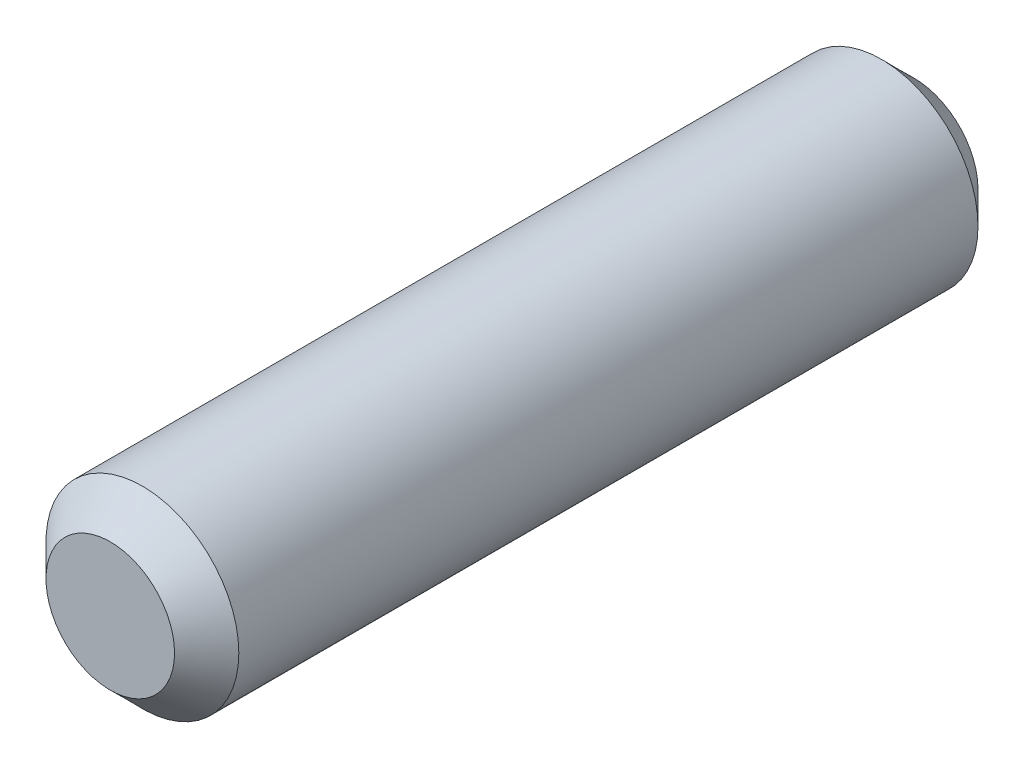
ISO-10303-21;
HEADER;
FILE_DESCRIPTION(('STEP AP214'),'2;1');
FILE_NAME('part.step','',(''),(''),'','','');
FILE_SCHEMA(('AUTOMOTIVE_DESIGN { 1 0 10303 214 1 1 1 1 }'));
ENDSEC;
DATA;
#1=APPLICATION_CONTEXT('core data for automotive mechanical design processes');
#2=APPLICATION_PROTOCOL_DEFINITION('international standard','automotive_design',2000,#1);
#3=PRODUCT_CONTEXT('',#1,'mechanical');
#4=PRODUCT('Part','Part','',(#3));
#5=PRODUCT_RELATED_PRODUCT_CATEGORY('part','',(#4));
#6=PRODUCT_DEFINITION_FORMATION('','',#4);
#7=PRODUCT_DEFINITION_CONTEXT('part definition',#1,'design');
#8=PRODUCT_DEFINITION('design','',#6,#7);
#9=PRODUCT_DEFINITION_SHAPE('','',#8);
#10=(LENGTH_UNIT() NAMED_UNIT(*) SI_UNIT(.MILLI.,.METRE.));
#11=(NAMED_UNIT(*) PLANE_ANGLE_UNIT() SI_UNIT($,.RADIAN.));
#12=(NAMED_UNIT(*) SI_UNIT($,.STERADIAN.) SOLID_ANGLE_UNIT());
#13=UNCERTAINTY_MEASURE_WITH_UNIT(LENGTH_MEASURE(1.E-05),#10,'distance_accuracy_value','');
#14=(GEOMETRIC_REPRESENTATION_CONTEXT(3) GLOBAL_UNCERTAINTY_ASSIGNED_CONTEXT((#13)) GLOBAL_UNIT_ASSIGNED_CONTEXT((#10,
#11,#12)) REPRESENTATION_CONTEXT('',''));
#15=CARTESIAN_POINT('',(0.,0.,0.));
#16=DIRECTION('',(0.,0.,1.));
#17=DIRECTION('',(1.,0.,0.));
#18=AXIS2_PLACEMENT_3D('',#15,#16,#17);
#19=CARTESIAN_POINT('',(0.,0.,25.));
#20=DIRECTION('',(0.,0.,-1.));
#21=DIRECTION('',(-1.,0.,0.));
#22=AXIS2_PLACEMENT_3D('',#19,#20,#21);
#23=CYLINDRICAL_SURFACE('',#22,3.);
#24=CARTESIAN_POINT('',(0.,0.,0.999999999999997));
#25=DIRECTION('',(0.,0.,1.));
#26=DIRECTION('',(1.,0.,0.));
#27=AXIS2_PLACEMENT_3D('',#24,#25,#26);
#28=CIRCLE('',#27,3.);
#29=CARTESIAN_POINT('',(3.,0.,0.999999999999997));
#30=VERTEX_POINT('',#29);
#31=EDGE_CURVE('E43',#30,#30,#28,.T.);
#32=ORIENTED_EDGE('',*,*,#31,.T.);
#33=EDGE_LOOP('',(#32));
#34=FACE_BOUND('',#33,.T.);
#35=CARTESIAN_POINT('',(0.,0.,24.));
#36=DIRECTION('',(0.,0.,1.));
#37=DIRECTION('',(1.,0.,0.));
#38=AXIS2_PLACEMENT_3D('',#35,#36,#37);
#39=CIRCLE('',#38,3.);
#40=CARTESIAN_POINT('',(3.,0.,24.));
#41=VERTEX_POINT('',#40);
#42=EDGE_CURVE('E47',#41,#41,#39,.F.);
#43=ORIENTED_EDGE('',*,*,#42,.T.);
#44=EDGE_LOOP('',(#43));
#45=FACE_BOUND('',#44,.T.);
#46=ADVANCED_FACE('F32',(#34,#45),#23,.T.);
#47=CARTESIAN_POINT('',(0.,0.,25.));
#48=DIRECTION('',(0.,0.,1.));
#49=DIRECTION('',(1.,0.,0.));
#50=AXIS2_PLACEMENT_3D('',#47,#48,#49);
#51=PLANE('',#50);
#52=CARTESIAN_POINT('',(0.,0.,25.));
#53=DIRECTION('',(0.,0.,1.));
#54=DIRECTION('',(1.,0.,0.));
#55=AXIS2_PLACEMENT_3D('',#52,#53,#54);
#56=CIRCLE('',#55,1.99999999999999);
#57=CARTESIAN_POINT('',(1.99999999999999,0.,25.));
#58=VERTEX_POINT('',#57);
#59=EDGE_CURVE('E10',#58,#58,#56,.T.);
#60=ORIENTED_EDGE('',*,*,#59,.T.);
#61=EDGE_LOOP('',(#60));
#62=FACE_BOUND('',#61,.T.);
#63=ADVANCED_FACE('F63',(#62),#51,.T.);
#64=CARTESIAN_POINT('',(0.,0.,0.));
#65=DIRECTION('',(0.,0.,1.));
#66=DIRECTION('',(1.,0.,0.));
#67=AXIS2_PLACEMENT_3D('',#64,#65,#66);
#68=PLANE('',#67);
#69=CARTESIAN_POINT('',(0.,0.,0.));
#70=DIRECTION('',(0.,0.,1.));
#71=DIRECTION('',(1.,0.,0.));
#72=AXIS2_PLACEMENT_3D('',#69,#70,#71);
#73=CIRCLE('',#72,2.);
#74=CARTESIAN_POINT('',(2.,0.,0.));
#75=VERTEX_POINT('',#74);
#76=EDGE_CURVE('E39',#75,#75,#73,.F.);
#77=ORIENTED_EDGE('',*,*,#76,.T.);
#78=EDGE_LOOP('',(#77));
#79=FACE_BOUND('',#78,.T.);
#80=ADVANCED_FACE('F60',(#79),#68,.F.);
#81=CARTESIAN_POINT('',(0.,0.,0.999999999999997));
#82=DIRECTION('',(0.,0.,1.));
#83=DIRECTION('',(1.,0.,0.));
#84=AXIS2_PLACEMENT_3D('',#81,#82,#83);
#85=CONICAL_SURFACE('',#84,3.,0.785398163397452);
#86=ORIENTED_EDGE('',*,*,#76,.F.);
#87=EDGE_LOOP('',(#86));
#88=FACE_BOUND('',#87,.T.);
#89=ORIENTED_EDGE('',*,*,#31,.F.);
#90=EDGE_LOOP('',(#89));
#91=FACE_BOUND('',#90,.T.);
#92=ADVANCED_FACE('F56',(#88,#91),#85,.T.);
#93=CARTESIAN_POINT('',(0.,0.,25.));
#94=DIRECTION('',(0.,0.,-1.));
#95=DIRECTION('',(-1.,0.,0.));
#96=AXIS2_PLACEMENT_3D('',#93,#94,#95);
#97=CONICAL_SURFACE('',#96,1.99999999999999,0.785398163397447);
#98=ORIENTED_EDGE('',*,*,#42,.F.);
#99=EDGE_LOOP('',(#98));
#100=FACE_BOUND('',#99,.T.);
#101=ORIENTED_EDGE('',*,*,#59,.F.);
#102=EDGE_LOOP('',(#101));
#103=FACE_BOUND('',#102,.T.);
#104=ADVANCED_FACE('F34',(#100,#103),#97,.T.);
#105=CLOSED_SHELL('',(#46,#63,#80,#92,#104));
#106=MANIFOLD_SOLID_BREP('B2',#105);
#107=ADVANCED_BREP_SHAPE_REPRESENTATION('',(#18,#106),#14);
#108=SHAPE_DEFINITION_REPRESENTATION(#9,#107);
ENDSEC;
END-ISO-10303-21;
